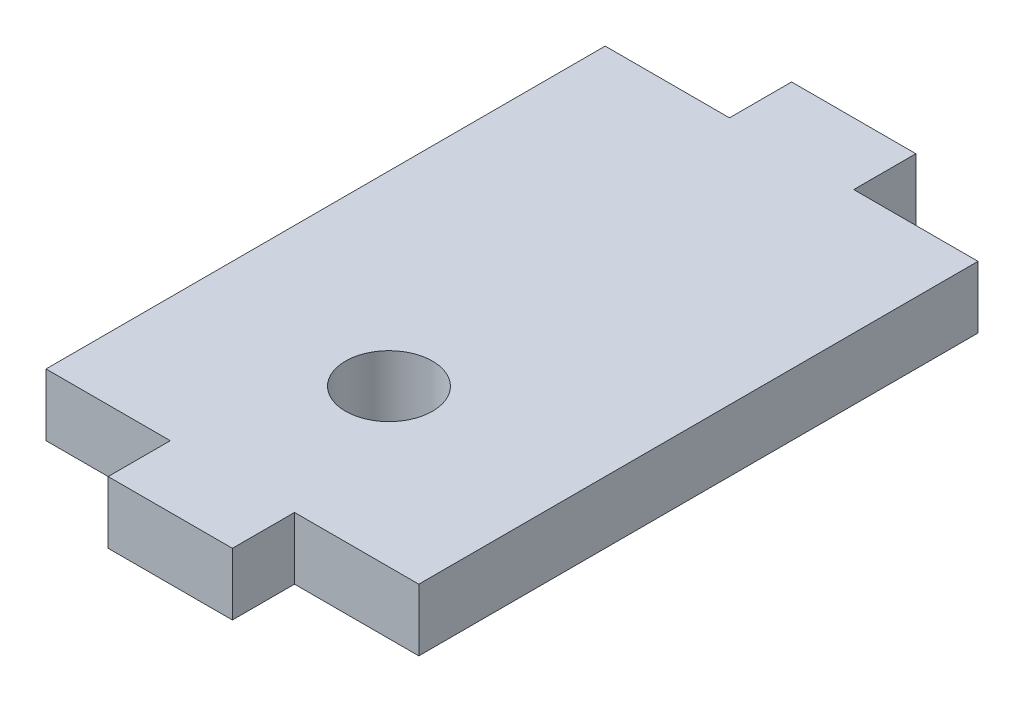
ISO-10303-21;
HEADER;
FILE_DESCRIPTION(('STEP AP214'),'2;1');
FILE_NAME('part.step','',(''),(''),'','','');
FILE_SCHEMA(('AUTOMOTIVE_DESIGN { 1 0 10303 214 1 1 1 1 }'));
ENDSEC;
DATA;
#1=APPLICATION_CONTEXT('core data for automotive mechanical design processes');
#2=APPLICATION_PROTOCOL_DEFINITION('international standard','automotive_design',2000,#1);
#3=PRODUCT_CONTEXT('',#1,'mechanical');
#4=PRODUCT('Part','Part','',(#3));
#5=PRODUCT_RELATED_PRODUCT_CATEGORY('part','',(#4));
#6=PRODUCT_DEFINITION_FORMATION('','',#4);
#7=PRODUCT_DEFINITION_CONTEXT('part definition',#1,'design');
#8=PRODUCT_DEFINITION('design','',#6,#7);
#9=PRODUCT_DEFINITION_SHAPE('','',#8);
#10=(LENGTH_UNIT() NAMED_UNIT(*) SI_UNIT(.MILLI.,.METRE.));
#11=(NAMED_UNIT(*) PLANE_ANGLE_UNIT() SI_UNIT($,.RADIAN.));
#12=(NAMED_UNIT(*) SI_UNIT($,.STERADIAN.) SOLID_ANGLE_UNIT());
#13=UNCERTAINTY_MEASURE_WITH_UNIT(LENGTH_MEASURE(1.E-05),#10,'distance_accuracy_value','');
#14=(GEOMETRIC_REPRESENTATION_CONTEXT(3) GLOBAL_UNCERTAINTY_ASSIGNED_CONTEXT((#13)) GLOBAL_UNIT_ASSIGNED_CONTEXT((#10,
#11,#12)) REPRESENTATION_CONTEXT('',''));
#15=CARTESIAN_POINT('',(0.,0.,0.));
#16=DIRECTION('',(0.,0.,1.));
#17=DIRECTION('',(1.,0.,0.));
#18=AXIS2_PLACEMENT_3D('',#15,#16,#17);
#19=CARTESIAN_POINT('',(0.,5.,22.5));
#20=DIRECTION('',(0.,0.,1.));
#21=DIRECTION('',(1.,0.,0.));
#22=AXIS2_PLACEMENT_3D('',#19,#20,#21);
#23=PLANE('',#22);
#24=DIRECTION('',(-1.,0.,0.));
#25=VECTOR('',#24,1.);
#26=CARTESIAN_POINT('',(0.,0.,22.5));
#27=LINE('',#26,#25);
#28=CARTESIAN_POINT('',(15.,0.,22.5));
#29=VERTEX_POINT('',#28);
#30=CARTESIAN_POINT('',(5.,0.,22.5));
#31=VERTEX_POINT('',#30);
#32=EDGE_CURVE('E204',#29,#31,#27,.T.);
#33=ORIENTED_EDGE('',*,*,#32,.F.);
#34=DIRECTION('',(0.,-1.,0.));
#35=VECTOR('',#34,1.);
#36=CARTESIAN_POINT('',(15.,5.,22.5));
#37=LINE('',#36,#35);
#38=CARTESIAN_POINT('',(15.,5.,22.5));
#39=VERTEX_POINT('',#38);
#40=EDGE_CURVE('E223',#39,#29,#37,.T.);
#41=ORIENTED_EDGE('',*,*,#40,.F.);
#42=DIRECTION('',(-1.,0.,0.));
#43=VECTOR('',#42,1.);
#44=CARTESIAN_POINT('',(0.,5.,22.5));
#45=LINE('',#44,#43);
#46=CARTESIAN_POINT('',(5.,5.,22.5));
#47=VERTEX_POINT('',#46);
#48=EDGE_CURVE('E169',#39,#47,#45,.T.);
#49=ORIENTED_EDGE('',*,*,#48,.T.);
#50=DIRECTION('',(0.,-1.,0.));
#51=VECTOR('',#50,1.);
#52=CARTESIAN_POINT('',(5.,5.,22.5));
#53=LINE('',#52,#51);
#54=EDGE_CURVE('E227',#47,#31,#53,.T.);
#55=ORIENTED_EDGE('',*,*,#54,.T.);
#56=EDGE_LOOP('',(#33,#41,#49,#55));
#57=FACE_BOUND('',#56,.T.);
#58=ADVANCED_FACE('F44',(#57),#23,.T.);
#59=CARTESIAN_POINT('',(5.,5.,0.));
#60=DIRECTION('',(1.,0.,0.));
#61=DIRECTION('',(0.,0.,-1.));
#62=AXIS2_PLACEMENT_3D('',#59,#60,#61);
#63=PLANE('',#62);
#64=DIRECTION('',(0.,0.,1.));
#65=VECTOR('',#64,1.);
#66=CARTESIAN_POINT('',(5.,0.,0.));
#67=LINE('',#66,#65);
#68=CARTESIAN_POINT('',(5.,0.,27.5));
#69=VERTEX_POINT('',#68);
#70=EDGE_CURVE('E212',#31,#69,#67,.T.);
#71=ORIENTED_EDGE('',*,*,#70,.F.);
#72=ORIENTED_EDGE('',*,*,#54,.F.);
#73=DIRECTION('',(0.,0.,1.));
#74=VECTOR('',#73,1.);
#75=CARTESIAN_POINT('',(5.,5.,0.));
#76=LINE('',#75,#74);
#77=CARTESIAN_POINT('',(5.,5.,27.5));
#78=VERTEX_POINT('',#77);
#79=EDGE_CURVE('E177',#47,#78,#76,.T.);
#80=ORIENTED_EDGE('',*,*,#79,.T.);
#81=DIRECTION('',(0.,-1.,0.));
#82=VECTOR('',#81,1.);
#83=CARTESIAN_POINT('',(5.,5.,27.5));
#84=LINE('',#83,#82);
#85=EDGE_CURVE('E231',#78,#69,#84,.T.);
#86=ORIENTED_EDGE('',*,*,#85,.T.);
#87=EDGE_LOOP('',(#71,#72,#80,#86));
#88=FACE_BOUND('',#87,.T.);
#89=ADVANCED_FACE('F316',(#88),#63,.T.);
#90=CARTESIAN_POINT('',(0.,5.,27.5));
#91=DIRECTION('',(0.,0.,-1.));
#92=DIRECTION('',(-1.,0.,0.));
#93=AXIS2_PLACEMENT_3D('',#90,#91,#92);
#94=PLANE('',#93);
#95=DIRECTION('',(1.,0.,0.));
#96=VECTOR('',#95,1.);
#97=CARTESIAN_POINT('',(0.,0.,27.5));
#98=LINE('',#97,#96);
#99=CARTESIAN_POINT('',(-5.,0.,27.5));
#100=VERTEX_POINT('',#99);
#101=EDGE_CURVE('E208',#100,#69,#98,.T.);
#102=ORIENTED_EDGE('',*,*,#101,.T.);
#103=ORIENTED_EDGE('',*,*,#85,.F.);
#104=DIRECTION('',(1.,0.,0.));
#105=VECTOR('',#104,1.);
#106=CARTESIAN_POINT('',(0.,5.,27.5));
#107=LINE('',#106,#105);
#108=CARTESIAN_POINT('',(-5.,5.,27.5));
#109=VERTEX_POINT('',#108);
#110=EDGE_CURVE('E181',#109,#78,#107,.T.);
#111=ORIENTED_EDGE('',*,*,#110,.F.);
#112=DIRECTION('',(0.,-1.,0.));
#113=VECTOR('',#112,1.);
#114=CARTESIAN_POINT('',(-5.,5.,27.5));
#115=LINE('',#114,#113);
#116=EDGE_CURVE('E235',#109,#100,#115,.T.);
#117=ORIENTED_EDGE('',*,*,#116,.T.);
#118=EDGE_LOOP('',(#102,#103,#111,#117));
#119=FACE_BOUND('',#118,.T.);
#120=ADVANCED_FACE('F321',(#119),#94,.F.);
#121=CARTESIAN_POINT('',(-5.,5.,0.));
#122=DIRECTION('',(1.,0.,0.));
#123=DIRECTION('',(0.,0.,-1.));
#124=AXIS2_PLACEMENT_3D('',#121,#122,#123);
#125=PLANE('',#124);
#126=DIRECTION('',(0.,0.,1.));
#127=VECTOR('',#126,1.);
#128=CARTESIAN_POINT('',(-5.,0.,0.));
#129=LINE('',#128,#127);
#130=CARTESIAN_POINT('',(-5.,0.,22.5));
#131=VERTEX_POINT('',#130);
#132=EDGE_CURVE('E203',#131,#100,#129,.T.);
#133=ORIENTED_EDGE('',*,*,#132,.T.);
#134=ORIENTED_EDGE('',*,*,#116,.F.);
#135=DIRECTION('',(0.,0.,1.));
#136=VECTOR('',#135,1.);
#137=CARTESIAN_POINT('',(-5.,5.,0.));
#138=LINE('',#137,#136);
#139=CARTESIAN_POINT('',(-5.,5.,22.5));
#140=VERTEX_POINT('',#139);
#141=EDGE_CURVE('E168',#140,#109,#138,.T.);
#142=ORIENTED_EDGE('',*,*,#141,.F.);
#143=DIRECTION('',(0.,-1.,0.));
#144=VECTOR('',#143,1.);
#145=CARTESIAN_POINT('',(-5.,5.,22.5));
#146=LINE('',#145,#144);
#147=EDGE_CURVE('E131',#140,#131,#146,.T.);
#148=ORIENTED_EDGE('',*,*,#147,.T.);
#149=EDGE_LOOP('',(#133,#134,#142,#148));
#150=FACE_BOUND('',#149,.T.);
#151=ADVANCED_FACE('F245',(#150),#125,.F.);
#152=CARTESIAN_POINT('',(-15.,0.,22.5));
#153=VERTEX_POINT('',#152);
#154=EDGE_CURVE('E199',#131,#153,#27,.T.);
#155=ORIENTED_EDGE('',*,*,#154,.F.);
#156=ORIENTED_EDGE('',*,*,#147,.F.);
#157=CARTESIAN_POINT('',(-15.,5.,22.5));
#158=VERTEX_POINT('',#157);
#159=EDGE_CURVE('E163',#140,#158,#45,.T.);
#160=ORIENTED_EDGE('',*,*,#159,.T.);
#161=DIRECTION('',(0.,-1.,0.));
#162=VECTOR('',#161,1.);
#163=CARTESIAN_POINT('',(-15.,5.,22.5));
#164=LINE('',#163,#162);
#165=EDGE_CURVE('E123',#158,#153,#164,.T.);
#166=ORIENTED_EDGE('',*,*,#165,.T.);
#167=EDGE_LOOP('',(#155,#156,#160,#166));
#168=FACE_BOUND('',#167,.T.);
#169=ADVANCED_FACE('F257',(#168),#23,.T.);
#170=CARTESIAN_POINT('',(0.,5.,9.9));
#171=DIRECTION('',(0.,-1.,0.));
#172=DIRECTION('',(0.,0.,-1.));
#173=AXIS2_PLACEMENT_3D('',#170,#171,#172);
#174=CYLINDRICAL_SURFACE('',#173,3.5);
#175=CARTESIAN_POINT('',(0.,5.,9.9));
#176=DIRECTION('',(0.,1.,0.));
#177=DIRECTION('',(0.,0.,1.));
#178=AXIS2_PLACEMENT_3D('',#175,#176,#177);
#179=CIRCLE('',#178,3.5);
#180=CARTESIAN_POINT('',(0.,5.,13.4));
#181=VERTEX_POINT('',#180);
#182=EDGE_CURVE('E156',#181,#181,#179,.T.);
#183=ORIENTED_EDGE('',*,*,#182,.T.);
#184=EDGE_LOOP('',(#183));
#185=FACE_BOUND('',#184,.T.);
#186=CARTESIAN_POINT('',(0.,0.,9.9));
#187=DIRECTION('',(0.,1.,0.));
#188=DIRECTION('',(0.,0.,1.));
#189=AXIS2_PLACEMENT_3D('',#186,#187,#188);
#190=CIRCLE('',#189,3.5);
#191=CARTESIAN_POINT('',(0.,0.,13.4));
#192=VERTEX_POINT('',#191);
#193=EDGE_CURVE('E91',#192,#192,#190,.T.);
#194=ORIENTED_EDGE('',*,*,#193,.F.);
#195=EDGE_LOOP('',(#194));
#196=FACE_BOUND('',#195,.T.);
#197=ADVANCED_FACE('F326',(#185,#196),#174,.F.);
#198=CARTESIAN_POINT('',(15.,5.,0.));
#199=DIRECTION('',(1.,0.,0.));
#200=DIRECTION('',(0.,0.,-1.));
#201=AXIS2_PLACEMENT_3D('',#198,#199,#200);
#202=PLANE('',#201);
#203=DIRECTION('',(0.,0.,1.));
#204=VECTOR('',#203,1.);
#205=CARTESIAN_POINT('',(15.,0.,0.));
#206=LINE('',#205,#204);
#207=CARTESIAN_POINT('',(15.,0.,-22.5));
#208=VERTEX_POINT('',#207);
#209=EDGE_CURVE('E216',#208,#29,#206,.T.);
#210=ORIENTED_EDGE('',*,*,#209,.F.);
#211=DIRECTION('',(0.,-1.,0.));
#212=VECTOR('',#211,1.);
#213=CARTESIAN_POINT('',(15.,5.,-22.5));
#214=LINE('',#213,#212);
#215=CARTESIAN_POINT('',(15.,5.,-22.5));
#216=VERTEX_POINT('',#215);
#217=EDGE_CURVE('E188',#216,#208,#214,.T.);
#218=ORIENTED_EDGE('',*,*,#217,.F.);
#219=DIRECTION('',(0.,0.,1.));
#220=VECTOR('',#219,1.);
#221=CARTESIAN_POINT('',(15.,5.,0.));
#222=LINE('',#221,#220);
#223=EDGE_CURVE('E183',#216,#39,#222,.T.);
#224=ORIENTED_EDGE('',*,*,#223,.T.);
#225=ORIENTED_EDGE('',*,*,#40,.T.);
#226=EDGE_LOOP('',(#210,#218,#224,#225));
#227=FACE_BOUND('',#226,.T.);
#228=ADVANCED_FACE('F331',(#227),#202,.T.);
#229=CARTESIAN_POINT('',(-15.,5.,0.));
#230=DIRECTION('',(1.,0.,0.));
#231=DIRECTION('',(0.,0.,-1.));
#232=AXIS2_PLACEMENT_3D('',#229,#230,#231);
#233=PLANE('',#232);
#234=DIRECTION('',(0.,0.,1.));
#235=VECTOR('',#234,1.);
#236=CARTESIAN_POINT('',(-15.,0.,0.));
#237=LINE('',#236,#235);
#238=CARTESIAN_POINT('',(-15.,0.,-22.5));
#239=VERTEX_POINT('',#238);
#240=EDGE_CURVE('E196',#239,#153,#237,.T.);
#241=ORIENTED_EDGE('',*,*,#240,.T.);
#242=ORIENTED_EDGE('',*,*,#165,.F.);
#243=DIRECTION('',(0.,0.,1.));
#244=VECTOR('',#243,1.);
#245=CARTESIAN_POINT('',(-15.,5.,0.));
#246=LINE('',#245,#244);
#247=CARTESIAN_POINT('',(-15.,5.,-22.5));
#248=VERTEX_POINT('',#247);
#249=EDGE_CURVE('E154',#248,#158,#246,.T.);
#250=ORIENTED_EDGE('',*,*,#249,.F.);
#251=DIRECTION('',(0.,-1.,0.));
#252=VECTOR('',#251,1.);
#253=CARTESIAN_POINT('',(-15.,5.,-22.5));
#254=LINE('',#253,#252);
#255=EDGE_CURVE('E117',#248,#239,#254,.T.);
#256=ORIENTED_EDGE('',*,*,#255,.T.);
#257=EDGE_LOOP('',(#241,#242,#250,#256));
#258=FACE_BOUND('',#257,.T.);
#259=ADVANCED_FACE('F261',(#258),#233,.F.);
#260=CARTESIAN_POINT('',(0.,0.,0.));
#261=DIRECTION('',(0.,1.,0.));
#262=DIRECTION('',(0.,0.,1.));
#263=AXIS2_PLACEMENT_3D('',#260,#261,#262);
#264=PLANE('',#263);
#265=ORIENTED_EDGE('',*,*,#193,.T.);
#266=EDGE_LOOP('',(#265));
#267=FACE_BOUND('',#266,.T.);
#268=DIRECTION('',(-1.,0.,0.));
#269=VECTOR('',#268,1.);
#270=CARTESIAN_POINT('',(0.,0.,-22.5));
#271=LINE('',#270,#269);
#272=CARTESIAN_POINT('',(5.,0.,-22.5));
#273=VERTEX_POINT('',#272);
#274=EDGE_CURVE('E193',#208,#273,#271,.T.);
#275=ORIENTED_EDGE('',*,*,#274,.F.);
#276=ORIENTED_EDGE('',*,*,#209,.T.);
#277=ORIENTED_EDGE('',*,*,#32,.T.);
#278=ORIENTED_EDGE('',*,*,#70,.T.);
#279=ORIENTED_EDGE('',*,*,#101,.F.);
#280=ORIENTED_EDGE('',*,*,#132,.F.);
#281=ORIENTED_EDGE('',*,*,#154,.T.);
#282=ORIENTED_EDGE('',*,*,#240,.F.);
#283=CARTESIAN_POINT('',(-5.,0.,-22.5));
#284=VERTEX_POINT('',#283);
#285=EDGE_CURVE('E192',#284,#239,#271,.T.);
#286=ORIENTED_EDGE('',*,*,#285,.F.);
#287=DIRECTION('',(0.,0.,1.));
#288=VECTOR('',#287,1.);
#289=CARTESIAN_POINT('',(-5.,0.,-27.5));
#290=LINE('',#289,#288);
#291=CARTESIAN_POINT('',(-5.,0.,-27.5));
#292=VERTEX_POINT('',#291);
#293=EDGE_CURVE('E103',#292,#284,#290,.T.);
#294=ORIENTED_EDGE('',*,*,#293,.F.);
#295=DIRECTION('',(-1.,0.,0.));
#296=VECTOR('',#295,1.);
#297=CARTESIAN_POINT('',(5.,0.,-27.5));
#298=LINE('',#297,#296);
#299=CARTESIAN_POINT('',(5.,0.,-27.5));
#300=VERTEX_POINT('',#299);
#301=EDGE_CURVE('E80',#300,#292,#298,.T.);
#302=ORIENTED_EDGE('',*,*,#301,.F.);
#303=DIRECTION('',(0.,0.,1.));
#304=VECTOR('',#303,1.);
#305=CARTESIAN_POINT('',(5.,0.,-27.5));
#306=LINE('',#305,#304);
#307=EDGE_CURVE('E100',#300,#273,#306,.T.);
#308=ORIENTED_EDGE('',*,*,#307,.T.);
#309=EDGE_LOOP('',(#275,#276,#277,#278,#279,#280,#281,#282,#286,#294,#302,#308));
#310=FACE_BOUND('',#309,.T.);
#311=ADVANCED_FACE('F98',(#267,#310),#264,.F.);
#312=CARTESIAN_POINT('',(0.,5.,0.));
#313=DIRECTION('',(0.,1.,0.));
#314=DIRECTION('',(0.,0.,1.));
#315=AXIS2_PLACEMENT_3D('',#312,#313,#314);
#316=PLANE('',#315);
#317=ORIENTED_EDGE('',*,*,#182,.F.);
#318=EDGE_LOOP('',(#317));
#319=FACE_BOUND('',#318,.T.);
#320=DIRECTION('',(-1.,0.,0.));
#321=VECTOR('',#320,1.);
#322=CARTESIAN_POINT('',(0.,5.,-22.5));
#323=LINE('',#322,#321);
#324=CARTESIAN_POINT('',(5.,5.,-22.5));
#325=VERTEX_POINT('',#324);
#326=EDGE_CURVE('E149',#216,#325,#323,.T.);
#327=ORIENTED_EDGE('',*,*,#326,.T.);
#328=DIRECTION('',(0.,0.,1.));
#329=VECTOR('',#328,1.);
#330=CARTESIAN_POINT('',(5.,5.,-27.5));
#331=LINE('',#330,#329);
#332=CARTESIAN_POINT('',(5.,5.,-27.5));
#333=VERTEX_POINT('',#332);
#334=EDGE_CURVE('E105',#333,#325,#331,.T.);
#335=ORIENTED_EDGE('',*,*,#334,.F.);
#336=DIRECTION('',(-1.,0.,0.));
#337=VECTOR('',#336,1.);
#338=CARTESIAN_POINT('',(5.,5.,-27.5));
#339=LINE('',#338,#337);
#340=CARTESIAN_POINT('',(-5.,5.,-27.5));
#341=VERTEX_POINT('',#340);
#342=EDGE_CURVE('E85',#333,#341,#339,.T.);
#343=ORIENTED_EDGE('',*,*,#342,.T.);
#344=DIRECTION('',(0.,0.,1.));
#345=VECTOR('',#344,1.);
#346=CARTESIAN_POINT('',(-5.,5.,-27.5));
#347=LINE('',#346,#345);
#348=CARTESIAN_POINT('',(-5.,5.,-22.5));
#349=VERTEX_POINT('',#348);
#350=EDGE_CURVE('E137',#341,#349,#347,.T.);
#351=ORIENTED_EDGE('',*,*,#350,.T.);
#352=EDGE_CURVE('E155',#349,#248,#323,.T.);
#353=ORIENTED_EDGE('',*,*,#352,.T.);
#354=ORIENTED_EDGE('',*,*,#249,.T.);
#355=ORIENTED_EDGE('',*,*,#159,.F.);
#356=ORIENTED_EDGE('',*,*,#141,.T.);
#357=ORIENTED_EDGE('',*,*,#110,.T.);
#358=ORIENTED_EDGE('',*,*,#79,.F.);
#359=ORIENTED_EDGE('',*,*,#48,.F.);
#360=ORIENTED_EDGE('',*,*,#223,.F.);
#361=EDGE_LOOP('',(#327,#335,#343,#351,#353,#354,#355,#356,#357,#358,#359,#360));
#362=FACE_BOUND('',#361,.T.);
#363=ADVANCED_FACE('F300',(#319,#362),#316,.T.);
#364=CARTESIAN_POINT('',(0.,5.,-22.5));
#365=DIRECTION('',(0.,0.,1.));
#366=DIRECTION('',(1.,0.,0.));
#367=AXIS2_PLACEMENT_3D('',#364,#365,#366);
#368=PLANE('',#367);
#369=ORIENTED_EDGE('',*,*,#352,.F.);
#370=DIRECTION('',(0.,-1.,0.));
#371=VECTOR('',#370,1.);
#372=CARTESIAN_POINT('',(-5.,5.,-22.5));
#373=LINE('',#372,#371);
#374=EDGE_CURVE('E54',#349,#284,#373,.T.);
#375=ORIENTED_EDGE('',*,*,#374,.T.);
#376=ORIENTED_EDGE('',*,*,#285,.T.);
#377=ORIENTED_EDGE('',*,*,#255,.F.);
#378=EDGE_LOOP('',(#369,#375,#376,#377));
#379=FACE_BOUND('',#378,.T.);
#380=ADVANCED_FACE('F302',(#379),#368,.F.);
#381=DIRECTION('',(0.,-1.,0.));
#382=VECTOR('',#381,1.);
#383=CARTESIAN_POINT('',(5.,5.,-22.5));
#384=LINE('',#383,#382);
#385=EDGE_CURVE('E12',#325,#273,#384,.T.);
#386=ORIENTED_EDGE('',*,*,#385,.F.);
#387=ORIENTED_EDGE('',*,*,#326,.F.);
#388=ORIENTED_EDGE('',*,*,#217,.T.);
#389=ORIENTED_EDGE('',*,*,#274,.T.);
#390=EDGE_LOOP('',(#386,#387,#388,#389));
#391=FACE_BOUND('',#390,.T.);
#392=ADVANCED_FACE('F304',(#391),#368,.F.);
#393=CARTESIAN_POINT('',(5.,5.,-27.5));
#394=DIRECTION('',(0.,0.,1.));
#395=DIRECTION('',(1.,0.,0.));
#396=AXIS2_PLACEMENT_3D('',#393,#394,#395);
#397=PLANE('',#396);
#398=ORIENTED_EDGE('',*,*,#301,.T.);
#399=DIRECTION('',(0.,-1.,0.));
#400=VECTOR('',#399,1.);
#401=CARTESIAN_POINT('',(-5.,5.,-27.5));
#402=LINE('',#401,#400);
#403=EDGE_CURVE('E92',#341,#292,#402,.T.);
#404=ORIENTED_EDGE('',*,*,#403,.F.);
#405=ORIENTED_EDGE('',*,*,#342,.F.);
#406=DIRECTION('',(0.,-1.,0.));
#407=VECTOR('',#406,1.);
#408=CARTESIAN_POINT('',(5.,5.,-27.5));
#409=LINE('',#408,#407);
#410=EDGE_CURVE('E83',#333,#300,#409,.T.);
#411=ORIENTED_EDGE('',*,*,#410,.T.);
#412=EDGE_LOOP('',(#398,#404,#405,#411));
#413=FACE_BOUND('',#412,.T.);
#414=ADVANCED_FACE('F84',(#413),#397,.F.);
#415=CARTESIAN_POINT('',(-5.,5.,-27.5));
#416=DIRECTION('',(1.,0.,0.));
#417=DIRECTION('',(0.,0.,-1.));
#418=AXIS2_PLACEMENT_3D('',#415,#416,#417);
#419=PLANE('',#418);
#420=ORIENTED_EDGE('',*,*,#293,.T.);
#421=ORIENTED_EDGE('',*,*,#374,.F.);
#422=ORIENTED_EDGE('',*,*,#350,.F.);
#423=ORIENTED_EDGE('',*,*,#403,.T.);
#424=EDGE_LOOP('',(#420,#421,#422,#423));
#425=FACE_BOUND('',#424,.T.);
#426=ADVANCED_FACE('F360',(#425),#419,.F.);
#427=CARTESIAN_POINT('',(5.,5.,-27.5));
#428=DIRECTION('',(1.,0.,0.));
#429=DIRECTION('',(0.,0.,-1.));
#430=AXIS2_PLACEMENT_3D('',#427,#428,#429);
#431=PLANE('',#430);
#432=ORIENTED_EDGE('',*,*,#307,.F.);
#433=ORIENTED_EDGE('',*,*,#410,.F.);
#434=ORIENTED_EDGE('',*,*,#334,.T.);
#435=ORIENTED_EDGE('',*,*,#385,.T.);
#436=EDGE_LOOP('',(#432,#433,#434,#435));
#437=FACE_BOUND('',#436,.T.);
#438=ADVANCED_FACE('F46',(#437),#431,.T.);
#439=CLOSED_SHELL('',(#58,#89,#120,#151,#169,#197,#228,#259,#311,#363,#380,#392,#414,#426,#438));
#440=MANIFOLD_SOLID_BREP('B2',#439);
#441=ADVANCED_BREP_SHAPE_REPRESENTATION('',(#18,#440),#14);
#442=SHAPE_DEFINITION_REPRESENTATION(#9,#441);
ENDSEC;
END-ISO-10303-21;
